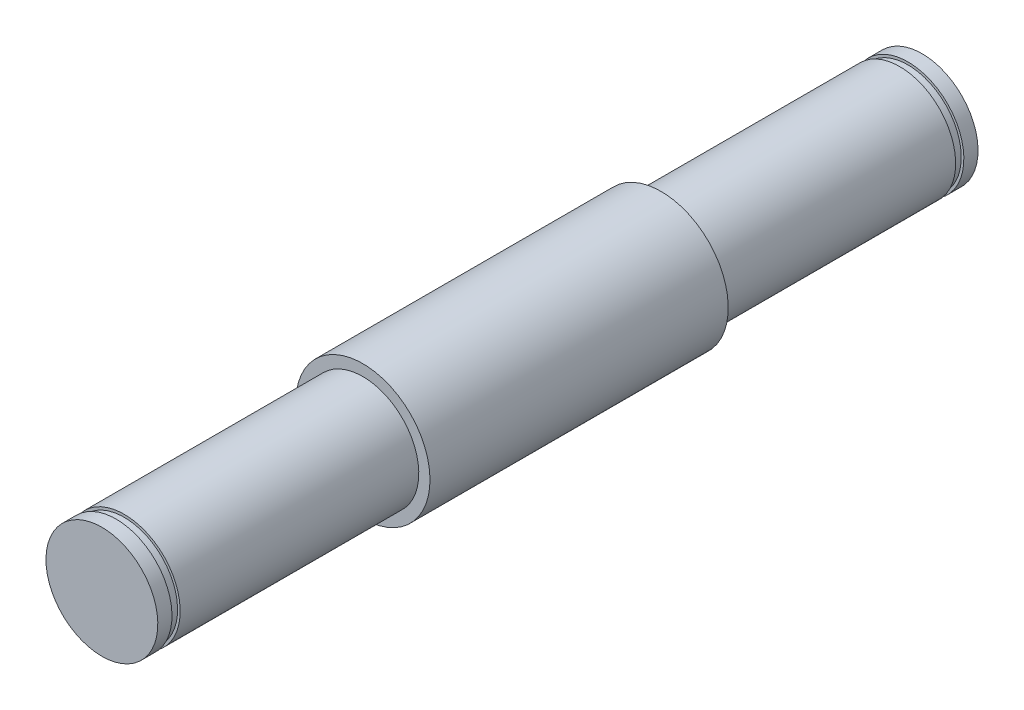
ISO-10303-21;
HEADER;
FILE_DESCRIPTION(('STEP AP214'),'2;1');
FILE_NAME('part.step','',(''),(''),'','','');
FILE_SCHEMA(('AUTOMOTIVE_DESIGN { 1 0 10303 214 1 1 1 1 }'));
ENDSEC;
DATA;
#1=APPLICATION_CONTEXT('core data for automotive mechanical design processes');
#2=APPLICATION_PROTOCOL_DEFINITION('international standard','automotive_design',2000,#1);
#3=PRODUCT_CONTEXT('',#1,'mechanical');
#4=PRODUCT('Part','Part','',(#3));
#5=PRODUCT_RELATED_PRODUCT_CATEGORY('part','',(#4));
#6=PRODUCT_DEFINITION_FORMATION('','',#4);
#7=PRODUCT_DEFINITION_CONTEXT('part definition',#1,'design');
#8=PRODUCT_DEFINITION('design','',#6,#7);
#9=PRODUCT_DEFINITION_SHAPE('','',#8);
#10=(LENGTH_UNIT() NAMED_UNIT(*) SI_UNIT(.MILLI.,.METRE.));
#11=(NAMED_UNIT(*) PLANE_ANGLE_UNIT() SI_UNIT($,.RADIAN.));
#12=(NAMED_UNIT(*) SI_UNIT($,.STERADIAN.) SOLID_ANGLE_UNIT());
#13=UNCERTAINTY_MEASURE_WITH_UNIT(LENGTH_MEASURE(1.E-05),#10,'distance_accuracy_value','');
#14=(GEOMETRIC_REPRESENTATION_CONTEXT(3) GLOBAL_UNCERTAINTY_ASSIGNED_CONTEXT((#13)) GLOBAL_UNIT_ASSIGNED_CONTEXT((#10,
#11,#12)) REPRESENTATION_CONTEXT('',''));
#15=CARTESIAN_POINT('',(0.,0.,0.));
#16=DIRECTION('',(0.,0.,1.));
#17=DIRECTION('',(1.,0.,0.));
#18=AXIS2_PLACEMENT_3D('',#15,#16,#17);
#19=CARTESIAN_POINT('',(0.,-7.5,55.));
#20=DIRECTION('',(0.,0.,1.));
#21=DIRECTION('',(0.,-1.,0.));
#22=AXIS2_PLACEMENT_3D('',#19,#20,#21);
#23=PLANE('',#22);
#24=CARTESIAN_POINT('',(0.,0.,55.));
#25=DIRECTION('',(0.,0.,1.));
#26=DIRECTION('',(0.,-1.,0.));
#27=AXIS2_PLACEMENT_3D('',#24,#25,#26);
#28=CIRCLE('',#27,7.5);
#29=CARTESIAN_POINT('',(0.,-7.5,55.));
#30=VERTEX_POINT('',#29);
#31=EDGE_CURVE('E78',#30,#30,#28,.T.);
#32=ORIENTED_EDGE('',*,*,#31,.T.);
#33=EDGE_LOOP('',(#32));
#34=FACE_BOUND('',#33,.T.);
#35=ADVANCED_FACE('F32',(#34),#23,.T.);
#36=CARTESIAN_POINT('',(0.,0.,-55.));
#37=DIRECTION('',(0.,0.,-1.));
#38=DIRECTION('',(0.,1.,0.));
#39=AXIS2_PLACEMENT_3D('',#36,#37,#38);
#40=PLANE('',#39);
#41=CARTESIAN_POINT('',(0.,0.,-55.));
#42=DIRECTION('',(0.,0.,1.));
#43=DIRECTION('',(0.,-1.,0.));
#44=AXIS2_PLACEMENT_3D('',#41,#42,#43);
#45=CIRCLE('',#44,7.5);
#46=CARTESIAN_POINT('',(0.,-7.5,-55.));
#47=VERTEX_POINT('',#46);
#48=EDGE_CURVE('E10',#47,#47,#45,.T.);
#49=ORIENTED_EDGE('',*,*,#48,.F.);
#50=EDGE_LOOP('',(#49));
#51=FACE_BOUND('',#50,.T.);
#52=ADVANCED_FACE('F95',(#51),#40,.T.);
#53=CARTESIAN_POINT('',(0.,0.,55.));
#54=DIRECTION('',(0.,0.,1.));
#55=DIRECTION('',(0.,-1.,0.));
#56=AXIS2_PLACEMENT_3D('',#53,#54,#55);
#57=CYLINDRICAL_SURFACE('',#56,7.5);
#58=ORIENTED_EDGE('',*,*,#48,.T.);
#59=EDGE_LOOP('',(#58));
#60=FACE_BOUND('',#59,.T.);
#61=CARTESIAN_POINT('',(0.,0.,-53.1));
#62=DIRECTION('',(0.,0.,1.));
#63=DIRECTION('',(0.,-1.,0.));
#64=AXIS2_PLACEMENT_3D('',#61,#62,#63);
#65=CIRCLE('',#64,7.49999999999999);
#66=CARTESIAN_POINT('',(0.,-7.49999999999999,-53.1));
#67=VERTEX_POINT('',#66);
#68=EDGE_CURVE('E38',#67,#67,#65,.T.);
#69=ORIENTED_EDGE('',*,*,#68,.F.);
#70=EDGE_LOOP('',(#69));
#71=FACE_BOUND('',#70,.T.);
#72=ADVANCED_FACE('F99',(#60,#71),#57,.T.);
#73=CARTESIAN_POINT('',(0.,-7.49999999999999,-53.1));
#74=DIRECTION('',(0.,0.,1.));
#75=DIRECTION('',(0.,-1.,0.));
#76=AXIS2_PLACEMENT_3D('',#73,#74,#75);
#77=PLANE('',#76);
#78=ORIENTED_EDGE('',*,*,#68,.T.);
#79=EDGE_LOOP('',(#78));
#80=FACE_BOUND('',#79,.T.);
#81=CARTESIAN_POINT('',(0.,0.,-53.1));
#82=DIRECTION('',(0.,0.,1.));
#83=DIRECTION('',(0.,-1.,0.));
#84=AXIS2_PLACEMENT_3D('',#81,#82,#83);
#85=CIRCLE('',#84,7.15000000000001);
#86=CARTESIAN_POINT('',(0.,-7.15000000000001,-53.1));
#87=VERTEX_POINT('',#86);
#88=EDGE_CURVE('E42',#87,#87,#85,.T.);
#89=ORIENTED_EDGE('',*,*,#88,.F.);
#90=EDGE_LOOP('',(#89));
#91=FACE_BOUND('',#90,.T.);
#92=ADVANCED_FACE('F104',(#80,#91),#77,.T.);
#93=CARTESIAN_POINT('',(0.,0.,55.));
#94=DIRECTION('',(0.,0.,1.));
#95=DIRECTION('',(0.,-1.,0.));
#96=AXIS2_PLACEMENT_3D('',#93,#94,#95);
#97=CYLINDRICAL_SURFACE('',#96,7.15000000000001);
#98=ORIENTED_EDGE('',*,*,#88,.T.);
#99=EDGE_LOOP('',(#98));
#100=FACE_BOUND('',#99,.T.);
#101=CARTESIAN_POINT('',(0.,0.,-52.));
#102=DIRECTION('',(0.,0.,1.));
#103=DIRECTION('',(0.,-1.,0.));
#104=AXIS2_PLACEMENT_3D('',#101,#102,#103);
#105=CIRCLE('',#104,7.15000000000001);
#106=CARTESIAN_POINT('',(0.,-7.15000000000001,-52.));
#107=VERTEX_POINT('',#106);
#108=EDGE_CURVE('E46',#107,#107,#105,.T.);
#109=ORIENTED_EDGE('',*,*,#108,.F.);
#110=EDGE_LOOP('',(#109));
#111=FACE_BOUND('',#110,.T.);
#112=ADVANCED_FACE('F109',(#100,#111),#97,.T.);
#113=CARTESIAN_POINT('',(0.,-7.15000000000001,-52.));
#114=DIRECTION('',(0.,0.,-1.));
#115=DIRECTION('',(0.,1.,0.));
#116=AXIS2_PLACEMENT_3D('',#113,#114,#115);
#117=PLANE('',#116);
#118=ORIENTED_EDGE('',*,*,#108,.T.);
#119=EDGE_LOOP('',(#118));
#120=FACE_BOUND('',#119,.T.);
#121=CARTESIAN_POINT('',(0.,0.,-52.));
#122=DIRECTION('',(0.,0.,1.));
#123=DIRECTION('',(0.,-1.,0.));
#124=AXIS2_PLACEMENT_3D('',#121,#122,#123);
#125=CIRCLE('',#124,7.49999999999999);
#126=CARTESIAN_POINT('',(0.,-7.49999999999999,-52.));
#127=VERTEX_POINT('',#126);
#128=EDGE_CURVE('E51',#127,#127,#125,.T.);
#129=ORIENTED_EDGE('',*,*,#128,.F.);
#130=EDGE_LOOP('',(#129));
#131=FACE_BOUND('',#130,.T.);
#132=ADVANCED_FACE('F112',(#120,#131),#117,.T.);
#133=CARTESIAN_POINT('',(0.,0.,55.));
#134=DIRECTION('',(0.,0.,1.));
#135=DIRECTION('',(0.,-1.,0.));
#136=AXIS2_PLACEMENT_3D('',#133,#134,#135);
#137=CYLINDRICAL_SURFACE('',#136,7.49999999999999);
#138=ORIENTED_EDGE('',*,*,#128,.T.);
#139=EDGE_LOOP('',(#138));
#140=FACE_BOUND('',#139,.T.);
#141=CARTESIAN_POINT('',(0.,0.,-20.));
#142=DIRECTION('',(0.,0.,1.));
#143=DIRECTION('',(0.,-1.,0.));
#144=AXIS2_PLACEMENT_3D('',#141,#142,#143);
#145=CIRCLE('',#144,7.49999999999999);
#146=CARTESIAN_POINT('',(0.,-7.5,-20.));
#147=VERTEX_POINT('',#146);
#148=EDGE_CURVE('E54',#147,#147,#145,.T.);
#149=ORIENTED_EDGE('',*,*,#148,.F.);
#150=EDGE_LOOP('',(#149));
#151=FACE_BOUND('',#150,.T.);
#152=ADVANCED_FACE('F116',(#140,#151),#137,.T.);
#153=CARTESIAN_POINT('',(0.,-7.5,-20.));
#154=DIRECTION('',(0.,0.,-1.));
#155=DIRECTION('',(0.,1.,0.));
#156=AXIS2_PLACEMENT_3D('',#153,#154,#155);
#157=PLANE('',#156);
#158=ORIENTED_EDGE('',*,*,#148,.T.);
#159=EDGE_LOOP('',(#158));
#160=FACE_BOUND('',#159,.T.);
#161=CARTESIAN_POINT('',(0.,0.,-20.));
#162=DIRECTION('',(0.,0.,1.));
#163=DIRECTION('',(0.,-1.,0.));
#164=AXIS2_PLACEMENT_3D('',#161,#162,#163);
#165=CIRCLE('',#164,9.);
#166=CARTESIAN_POINT('',(0.,-9.,-20.));
#167=VERTEX_POINT('',#166);
#168=EDGE_CURVE('E57',#167,#167,#165,.T.);
#169=ORIENTED_EDGE('',*,*,#168,.F.);
#170=EDGE_LOOP('',(#169));
#171=FACE_BOUND('',#170,.T.);
#172=ADVANCED_FACE('F120',(#160,#171),#157,.T.);
#173=CARTESIAN_POINT('',(0.,0.,55.));
#174=DIRECTION('',(0.,0.,1.));
#175=DIRECTION('',(0.,-1.,0.));
#176=AXIS2_PLACEMENT_3D('',#173,#174,#175);
#177=CYLINDRICAL_SURFACE('',#176,9.);
#178=ORIENTED_EDGE('',*,*,#168,.T.);
#179=EDGE_LOOP('',(#178));
#180=FACE_BOUND('',#179,.T.);
#181=CARTESIAN_POINT('',(0.,0.,20.));
#182=DIRECTION('',(0.,0.,1.));
#183=DIRECTION('',(0.,-1.,0.));
#184=AXIS2_PLACEMENT_3D('',#181,#182,#183);
#185=CIRCLE('',#184,9.);
#186=CARTESIAN_POINT('',(0.,-9.,20.));
#187=VERTEX_POINT('',#186);
#188=EDGE_CURVE('E60',#187,#187,#185,.T.);
#189=ORIENTED_EDGE('',*,*,#188,.F.);
#190=EDGE_LOOP('',(#189));
#191=FACE_BOUND('',#190,.T.);
#192=ADVANCED_FACE('F124',(#180,#191),#177,.T.);
#193=CARTESIAN_POINT('',(0.,-9.,20.));
#194=DIRECTION('',(0.,0.,1.));
#195=DIRECTION('',(0.,-1.,0.));
#196=AXIS2_PLACEMENT_3D('',#193,#194,#195);
#197=PLANE('',#196);
#198=ORIENTED_EDGE('',*,*,#188,.T.);
#199=EDGE_LOOP('',(#198));
#200=FACE_BOUND('',#199,.T.);
#201=CARTESIAN_POINT('',(0.,0.,20.));
#202=DIRECTION('',(0.,0.,1.));
#203=DIRECTION('',(0.,-1.,0.));
#204=AXIS2_PLACEMENT_3D('',#201,#202,#203);
#205=CIRCLE('',#204,7.5);
#206=CARTESIAN_POINT('',(0.,-7.5,20.));
#207=VERTEX_POINT('',#206);
#208=EDGE_CURVE('E63',#207,#207,#205,.T.);
#209=ORIENTED_EDGE('',*,*,#208,.F.);
#210=EDGE_LOOP('',(#209));
#211=FACE_BOUND('',#210,.T.);
#212=ADVANCED_FACE('F128',(#200,#211),#197,.T.);
#213=CARTESIAN_POINT('',(0.,0.,55.));
#214=DIRECTION('',(0.,0.,1.));
#215=DIRECTION('',(0.,-1.,0.));
#216=AXIS2_PLACEMENT_3D('',#213,#214,#215);
#217=CYLINDRICAL_SURFACE('',#216,7.5);
#218=ORIENTED_EDGE('',*,*,#208,.T.);
#219=EDGE_LOOP('',(#218));
#220=FACE_BOUND('',#219,.T.);
#221=CARTESIAN_POINT('',(0.,0.,52.));
#222=DIRECTION('',(0.,0.,1.));
#223=DIRECTION('',(0.,-1.,0.));
#224=AXIS2_PLACEMENT_3D('',#221,#222,#223);
#225=CIRCLE('',#224,7.5);
#226=CARTESIAN_POINT('',(0.,-7.5,52.));
#227=VERTEX_POINT('',#226);
#228=EDGE_CURVE('E66',#227,#227,#225,.T.);
#229=ORIENTED_EDGE('',*,*,#228,.F.);
#230=EDGE_LOOP('',(#229));
#231=FACE_BOUND('',#230,.T.);
#232=ADVANCED_FACE('F132',(#220,#231),#217,.T.);
#233=CARTESIAN_POINT('',(0.,-7.5,52.));
#234=DIRECTION('',(0.,0.,1.));
#235=DIRECTION('',(0.,-1.,0.));
#236=AXIS2_PLACEMENT_3D('',#233,#234,#235);
#237=PLANE('',#236);
#238=ORIENTED_EDGE('',*,*,#228,.T.);
#239=EDGE_LOOP('',(#238));
#240=FACE_BOUND('',#239,.T.);
#241=CARTESIAN_POINT('',(0.,0.,52.));
#242=DIRECTION('',(0.,0.,1.));
#243=DIRECTION('',(0.,-1.,0.));
#244=AXIS2_PLACEMENT_3D('',#241,#242,#243);
#245=CIRCLE('',#244,7.15000000000001);
#246=CARTESIAN_POINT('',(0.,-7.15000000000001,52.));
#247=VERTEX_POINT('',#246);
#248=EDGE_CURVE('E69',#247,#247,#245,.T.);
#249=ORIENTED_EDGE('',*,*,#248,.F.);
#250=EDGE_LOOP('',(#249));
#251=FACE_BOUND('',#250,.T.);
#252=ADVANCED_FACE('F136',(#240,#251),#237,.T.);
#253=CARTESIAN_POINT('',(0.,0.,55.));
#254=DIRECTION('',(0.,0.,1.));
#255=DIRECTION('',(0.,-1.,0.));
#256=AXIS2_PLACEMENT_3D('',#253,#254,#255);
#257=CYLINDRICAL_SURFACE('',#256,7.15000000000001);
#258=ORIENTED_EDGE('',*,*,#248,.T.);
#259=EDGE_LOOP('',(#258));
#260=FACE_BOUND('',#259,.T.);
#261=CARTESIAN_POINT('',(0.,0.,53.1));
#262=DIRECTION('',(0.,0.,1.));
#263=DIRECTION('',(0.,-1.,0.));
#264=AXIS2_PLACEMENT_3D('',#261,#262,#263);
#265=CIRCLE('',#264,7.15000000000001);
#266=CARTESIAN_POINT('',(0.,-7.15000000000001,53.1));
#267=VERTEX_POINT('',#266);
#268=EDGE_CURVE('E72',#267,#267,#265,.T.);
#269=ORIENTED_EDGE('',*,*,#268,.F.);
#270=EDGE_LOOP('',(#269));
#271=FACE_BOUND('',#270,.T.);
#272=ADVANCED_FACE('F91',(#260,#271),#257,.T.);
#273=CARTESIAN_POINT('',(0.,-7.15000000000001,53.1));
#274=DIRECTION('',(0.,0.,-1.));
#275=DIRECTION('',(0.,1.,0.));
#276=AXIS2_PLACEMENT_3D('',#273,#274,#275);
#277=PLANE('',#276);
#278=ORIENTED_EDGE('',*,*,#268,.T.);
#279=EDGE_LOOP('',(#278));
#280=FACE_BOUND('',#279,.T.);
#281=CARTESIAN_POINT('',(0.,0.,53.1));
#282=DIRECTION('',(0.,0.,1.));
#283=DIRECTION('',(0.,-1.,0.));
#284=AXIS2_PLACEMENT_3D('',#281,#282,#283);
#285=CIRCLE('',#284,7.5);
#286=CARTESIAN_POINT('',(0.,-7.5,53.1));
#287=VERTEX_POINT('',#286);
#288=EDGE_CURVE('E75',#287,#287,#285,.T.);
#289=ORIENTED_EDGE('',*,*,#288,.F.);
#290=EDGE_LOOP('',(#289));
#291=FACE_BOUND('',#290,.T.);
#292=ADVANCED_FACE('F85',(#280,#291),#277,.T.);
#293=CARTESIAN_POINT('',(0.,0.,55.));
#294=DIRECTION('',(0.,0.,1.));
#295=DIRECTION('',(0.,-1.,0.));
#296=AXIS2_PLACEMENT_3D('',#293,#294,#295);
#297=CYLINDRICAL_SURFACE('',#296,7.5);
#298=ORIENTED_EDGE('',*,*,#288,.T.);
#299=EDGE_LOOP('',(#298));
#300=FACE_BOUND('',#299,.T.);
#301=ORIENTED_EDGE('',*,*,#31,.F.);
#302=EDGE_LOOP('',(#301));
#303=FACE_BOUND('',#302,.T.);
#304=ADVANCED_FACE('F83',(#300,#303),#297,.T.);
#305=CLOSED_SHELL('',(#35,#52,#72,#92,#112,#132,#152,#172,#192,#212,#232,#252,#272,#292,#304));
#306=MANIFOLD_SOLID_BREP('B2',#305);
#307=ADVANCED_BREP_SHAPE_REPRESENTATION('',(#18,#306),#14);
#308=SHAPE_DEFINITION_REPRESENTATION(#9,#307);
ENDSEC;
END-ISO-10303-21;
